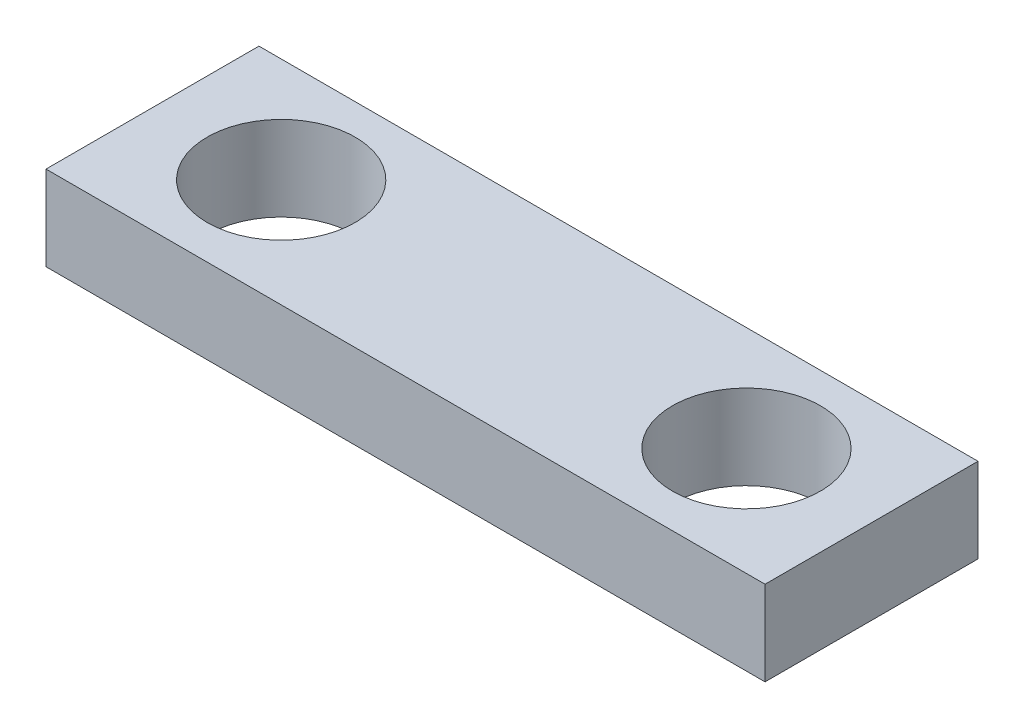
ISO-10303-21;
HEADER;
FILE_DESCRIPTION(('STEP AP214'),'2;1');
FILE_NAME('part.step','',(''),(''),'','','');
FILE_SCHEMA(('AUTOMOTIVE_DESIGN { 1 0 10303 214 1 1 1 1 }'));
ENDSEC;
DATA;
#1=APPLICATION_CONTEXT('core data for automotive mechanical design processes');
#2=APPLICATION_PROTOCOL_DEFINITION('international standard','automotive_design',2000,#1);
#3=PRODUCT_CONTEXT('',#1,'mechanical');
#4=PRODUCT('Part','Part','',(#3));
#5=PRODUCT_RELATED_PRODUCT_CATEGORY('part','',(#4));
#6=PRODUCT_DEFINITION_FORMATION('','',#4);
#7=PRODUCT_DEFINITION_CONTEXT('part definition',#1,'design');
#8=PRODUCT_DEFINITION('design','',#6,#7);
#9=PRODUCT_DEFINITION_SHAPE('','',#8);
#10=(LENGTH_UNIT() NAMED_UNIT(*) SI_UNIT(.MILLI.,.METRE.));
#11=(NAMED_UNIT(*) PLANE_ANGLE_UNIT() SI_UNIT($,.RADIAN.));
#12=(NAMED_UNIT(*) SI_UNIT($,.STERADIAN.) SOLID_ANGLE_UNIT());
#13=UNCERTAINTY_MEASURE_WITH_UNIT(LENGTH_MEASURE(1.E-05),#10,'distance_accuracy_value','');
#14=(GEOMETRIC_REPRESENTATION_CONTEXT(3) GLOBAL_UNCERTAINTY_ASSIGNED_CONTEXT((#13)) GLOBAL_UNIT_ASSIGNED_CONTEXT((#10,
#11,#12)) REPRESENTATION_CONTEXT('',''));
#15=CARTESIAN_POINT('',(0.,0.,0.));
#16=DIRECTION('',(0.,0.,1.));
#17=DIRECTION('',(1.,0.,0.));
#18=AXIS2_PLACEMENT_3D('',#15,#16,#17);
#19=CARTESIAN_POINT('',(0.,2.,0.));
#20=DIRECTION('',(0.,1.,0.));
#21=DIRECTION('',(0.,0.,1.));
#22=AXIS2_PLACEMENT_3D('',#19,#20,#21);
#23=PLANE('',#22);
#24=CARTESIAN_POINT('',(-5.61881850166234,2.,-0.384006764925553));
#25=DIRECTION('',(0.,1.,0.));
#26=DIRECTION('',(0.,0.,1.));
#27=AXIS2_PLACEMENT_3D('',#24,#25,#26);
#28=CIRCLE('',#27,1.75);
#29=CARTESIAN_POINT('',(-5.61881850166234,2.,1.36599323507445));
#30=VERTEX_POINT('',#29);
#31=EDGE_CURVE('E106',#30,#30,#28,.T.);
#32=ORIENTED_EDGE('',*,*,#31,.F.);
#33=EDGE_LOOP('',(#32));
#34=FACE_BOUND('',#33,.T.);
#35=DIRECTION('',(0.,0.,1.));
#36=VECTOR('',#35,1.);
#37=CARTESIAN_POINT('',(-8.61881850166234,2.,-2.8587170277791));
#38=LINE('',#37,#36);
#39=CARTESIAN_POINT('',(-8.61881850166234,2.,-2.8587170277791));
#40=VERTEX_POINT('',#39);
#41=CARTESIAN_POINT('',(-8.61881850166234,2.,2.17603833457811));
#42=VERTEX_POINT('',#41);
#43=EDGE_CURVE('E91',#40,#42,#38,.T.);
#44=ORIENTED_EDGE('',*,*,#43,.T.);
#45=DIRECTION('',(1.,0.,0.));
#46=VECTOR('',#45,1.);
#47=CARTESIAN_POINT('',(-8.61881850166234,2.,2.17603833457811));
#48=LINE('',#47,#46);
#49=CARTESIAN_POINT('',(8.38118149833766,2.,2.17603833457811));
#50=VERTEX_POINT('',#49);
#51=EDGE_CURVE('E86',#42,#50,#48,.T.);
#52=ORIENTED_EDGE('',*,*,#51,.T.);
#53=DIRECTION('',(0.,0.,-1.));
#54=VECTOR('',#53,1.);
#55=CARTESIAN_POINT('',(8.38118149833766,2.,-2.8587170277791));
#56=LINE('',#55,#54);
#57=CARTESIAN_POINT('',(8.38118149833766,2.,-2.8587170277791));
#58=VERTEX_POINT('',#57);
#59=EDGE_CURVE('E89',#50,#58,#56,.T.);
#60=ORIENTED_EDGE('',*,*,#59,.T.);
#61=DIRECTION('',(-1.,0.,0.));
#62=VECTOR('',#61,1.);
#63=CARTESIAN_POINT('',(-8.61881850166234,2.,-2.8587170277791));
#64=LINE('',#63,#62);
#65=EDGE_CURVE('E56',#58,#40,#64,.T.);
#66=ORIENTED_EDGE('',*,*,#65,.T.);
#67=EDGE_LOOP('',(#44,#52,#60,#66));
#68=FACE_BOUND('',#67,.T.);
#69=CARTESIAN_POINT('',(5.38118149833766,2.,-0.384006764925553));
#70=DIRECTION('',(0.,1.,0.));
#71=DIRECTION('',(0.,0.,1.));
#72=AXIS2_PLACEMENT_3D('',#69,#70,#71);
#73=CIRCLE('',#72,1.75);
#74=CARTESIAN_POINT('',(5.38118149833766,2.,1.36599323507445));
#75=VERTEX_POINT('',#74);
#76=EDGE_CURVE('E121',#75,#75,#73,.T.);
#77=ORIENTED_EDGE('',*,*,#76,.F.);
#78=EDGE_LOOP('',(#77));
#79=FACE_BOUND('',#78,.T.);
#80=ADVANCED_FACE('F39',(#34,#68,#79),#23,.T.);
#81=CARTESIAN_POINT('',(0.,0.,0.));
#82=DIRECTION('',(0.,1.,0.));
#83=DIRECTION('',(0.,0.,1.));
#84=AXIS2_PLACEMENT_3D('',#81,#82,#83);
#85=PLANE('',#84);
#86=DIRECTION('',(0.,0.,1.));
#87=VECTOR('',#86,1.);
#88=CARTESIAN_POINT('',(-8.61881850166234,0.,-2.8587170277791));
#89=LINE('',#88,#87);
#90=CARTESIAN_POINT('',(-8.61881850166234,0.,-2.8587170277791));
#91=VERTEX_POINT('',#90);
#92=CARTESIAN_POINT('',(-8.61881850166234,0.,2.17603833457811));
#93=VERTEX_POINT('',#92);
#94=EDGE_CURVE('E103',#91,#93,#89,.T.);
#95=ORIENTED_EDGE('',*,*,#94,.F.);
#96=DIRECTION('',(-1.,0.,0.));
#97=VECTOR('',#96,1.);
#98=CARTESIAN_POINT('',(-8.61881850166234,0.,-2.8587170277791));
#99=LINE('',#98,#97);
#100=CARTESIAN_POINT('',(8.38118149833766,0.,-2.8587170277791));
#101=VERTEX_POINT('',#100);
#102=EDGE_CURVE('E79',#101,#91,#99,.T.);
#103=ORIENTED_EDGE('',*,*,#102,.F.);
#104=DIRECTION('',(0.,0.,-1.));
#105=VECTOR('',#104,1.);
#106=CARTESIAN_POINT('',(8.38118149833766,0.,-2.8587170277791));
#107=LINE('',#106,#105);
#108=CARTESIAN_POINT('',(8.38118149833766,0.,2.17603833457811));
#109=VERTEX_POINT('',#108);
#110=EDGE_CURVE('E73',#109,#101,#107,.T.);
#111=ORIENTED_EDGE('',*,*,#110,.F.);
#112=DIRECTION('',(1.,0.,0.));
#113=VECTOR('',#112,1.);
#114=CARTESIAN_POINT('',(-8.61881850166234,0.,2.17603833457811));
#115=LINE('',#114,#113);
#116=EDGE_CURVE('E95',#93,#109,#115,.T.);
#117=ORIENTED_EDGE('',*,*,#116,.F.);
#118=EDGE_LOOP('',(#95,#103,#111,#117));
#119=FACE_BOUND('',#118,.T.);
#120=CARTESIAN_POINT('',(-5.61881850166234,0.,-0.384006764925553));
#121=DIRECTION('',(0.,1.,0.));
#122=DIRECTION('',(0.,0.,1.));
#123=AXIS2_PLACEMENT_3D('',#120,#121,#122);
#124=CIRCLE('',#123,1.75);
#125=CARTESIAN_POINT('',(-5.61881850166234,0.,1.36599323507445));
#126=VERTEX_POINT('',#125);
#127=EDGE_CURVE('E118',#126,#126,#124,.T.);
#128=ORIENTED_EDGE('',*,*,#127,.T.);
#129=EDGE_LOOP('',(#128));
#130=FACE_BOUND('',#129,.T.);
#131=CARTESIAN_POINT('',(5.38118149833766,0.,-0.384006764925553));
#132=DIRECTION('',(0.,1.,0.));
#133=DIRECTION('',(0.,0.,1.));
#134=AXIS2_PLACEMENT_3D('',#131,#132,#133);
#135=CIRCLE('',#134,1.75);
#136=CARTESIAN_POINT('',(5.38118149833766,0.,1.36599323507445));
#137=VERTEX_POINT('',#136);
#138=EDGE_CURVE('E124',#137,#137,#135,.T.);
#139=ORIENTED_EDGE('',*,*,#138,.T.);
#140=EDGE_LOOP('',(#139));
#141=FACE_BOUND('',#140,.T.);
#142=ADVANCED_FACE('F114',(#119,#130,#141),#85,.F.);
#143=CARTESIAN_POINT('',(-8.61881850166234,2.,-2.8587170277791));
#144=DIRECTION('',(1.,0.,0.));
#145=DIRECTION('',(0.,0.,-1.));
#146=AXIS2_PLACEMENT_3D('',#143,#144,#145);
#147=PLANE('',#146);
#148=ORIENTED_EDGE('',*,*,#94,.T.);
#149=DIRECTION('',(0.,-1.,0.));
#150=VECTOR('',#149,1.);
#151=CARTESIAN_POINT('',(-8.61881850166234,2.,2.17603833457811));
#152=LINE('',#151,#150);
#153=EDGE_CURVE('E11',#42,#93,#152,.T.);
#154=ORIENTED_EDGE('',*,*,#153,.F.);
#155=ORIENTED_EDGE('',*,*,#43,.F.);
#156=DIRECTION('',(0.,-1.,0.));
#157=VECTOR('',#156,1.);
#158=CARTESIAN_POINT('',(-8.61881850166234,2.,-2.8587170277791));
#159=LINE('',#158,#157);
#160=EDGE_CURVE('E99',#40,#91,#159,.T.);
#161=ORIENTED_EDGE('',*,*,#160,.T.);
#162=EDGE_LOOP('',(#148,#154,#155,#161));
#163=FACE_BOUND('',#162,.T.);
#164=ADVANCED_FACE('F41',(#163),#147,.F.);
#165=CARTESIAN_POINT('',(-8.61881850166234,2.,2.17603833457811));
#166=DIRECTION('',(0.,0.,-1.));
#167=DIRECTION('',(-1.,0.,0.));
#168=AXIS2_PLACEMENT_3D('',#165,#166,#167);
#169=PLANE('',#168);
#170=ORIENTED_EDGE('',*,*,#116,.T.);
#171=DIRECTION('',(0.,-1.,0.));
#172=VECTOR('',#171,1.);
#173=CARTESIAN_POINT('',(8.38118149833766,2.,2.17603833457811));
#174=LINE('',#173,#172);
#175=EDGE_CURVE('E48',#50,#109,#174,.T.);
#176=ORIENTED_EDGE('',*,*,#175,.F.);
#177=ORIENTED_EDGE('',*,*,#51,.F.);
#178=ORIENTED_EDGE('',*,*,#153,.T.);
#179=EDGE_LOOP('',(#170,#176,#177,#178));
#180=FACE_BOUND('',#179,.T.);
#181=ADVANCED_FACE('F94',(#180),#169,.F.);
#182=CARTESIAN_POINT('',(8.38118149833766,2.,-2.8587170277791));
#183=DIRECTION('',(-1.,0.,0.));
#184=DIRECTION('',(0.,0.,1.));
#185=AXIS2_PLACEMENT_3D('',#182,#183,#184);
#186=PLANE('',#185);
#187=ORIENTED_EDGE('',*,*,#110,.T.);
#188=DIRECTION('',(0.,-1.,0.));
#189=VECTOR('',#188,1.);
#190=CARTESIAN_POINT('',(8.38118149833766,2.,-2.8587170277791));
#191=LINE('',#190,#189);
#192=EDGE_CURVE('E96',#58,#101,#191,.T.);
#193=ORIENTED_EDGE('',*,*,#192,.F.);
#194=ORIENTED_EDGE('',*,*,#59,.F.);
#195=ORIENTED_EDGE('',*,*,#175,.T.);
#196=EDGE_LOOP('',(#187,#193,#194,#195));
#197=FACE_BOUND('',#196,.T.);
#198=ADVANCED_FACE('F97',(#197),#186,.F.);
#199=CARTESIAN_POINT('',(-8.61881850166234,2.,-2.8587170277791));
#200=DIRECTION('',(0.,0.,1.));
#201=DIRECTION('',(1.,0.,0.));
#202=AXIS2_PLACEMENT_3D('',#199,#200,#201);
#203=PLANE('',#202);
#204=ORIENTED_EDGE('',*,*,#102,.T.);
#205=ORIENTED_EDGE('',*,*,#160,.F.);
#206=ORIENTED_EDGE('',*,*,#65,.F.);
#207=ORIENTED_EDGE('',*,*,#192,.T.);
#208=EDGE_LOOP('',(#204,#205,#206,#207));
#209=FACE_BOUND('',#208,.T.);
#210=ADVANCED_FACE('F111',(#209),#203,.F.);
#211=CARTESIAN_POINT('',(-5.61881850166234,2.,-0.384006764925553));
#212=DIRECTION('',(0.,-1.,0.));
#213=DIRECTION('',(0.,0.,-1.));
#214=AXIS2_PLACEMENT_3D('',#211,#212,#213);
#215=CYLINDRICAL_SURFACE('',#214,1.75);
#216=ORIENTED_EDGE('',*,*,#31,.T.);
#217=EDGE_LOOP('',(#216));
#218=FACE_BOUND('',#217,.T.);
#219=ORIENTED_EDGE('',*,*,#127,.F.);
#220=EDGE_LOOP('',(#219));
#221=FACE_BOUND('',#220,.T.);
#222=ADVANCED_FACE('F141',(#218,#221),#215,.F.);
#223=CARTESIAN_POINT('',(5.38118149833766,2.,-0.384006764925553));
#224=DIRECTION('',(0.,-1.,0.));
#225=DIRECTION('',(0.,0.,-1.));
#226=AXIS2_PLACEMENT_3D('',#223,#224,#225);
#227=CYLINDRICAL_SURFACE('',#226,1.75);
#228=ORIENTED_EDGE('',*,*,#76,.T.);
#229=EDGE_LOOP('',(#228));
#230=FACE_BOUND('',#229,.T.);
#231=ORIENTED_EDGE('',*,*,#138,.F.);
#232=EDGE_LOOP('',(#231));
#233=FACE_BOUND('',#232,.T.);
#234=ADVANCED_FACE('F130',(#230,#233),#227,.F.);
#235=CLOSED_SHELL('',(#80,#142,#164,#181,#198,#210,#222,#234));
#236=MANIFOLD_SOLID_BREP('B2',#235);
#237=ADVANCED_BREP_SHAPE_REPRESENTATION('',(#18,#236),#14);
#238=SHAPE_DEFINITION_REPRESENTATION(#9,#237);
ENDSEC;
END-ISO-10303-21;
